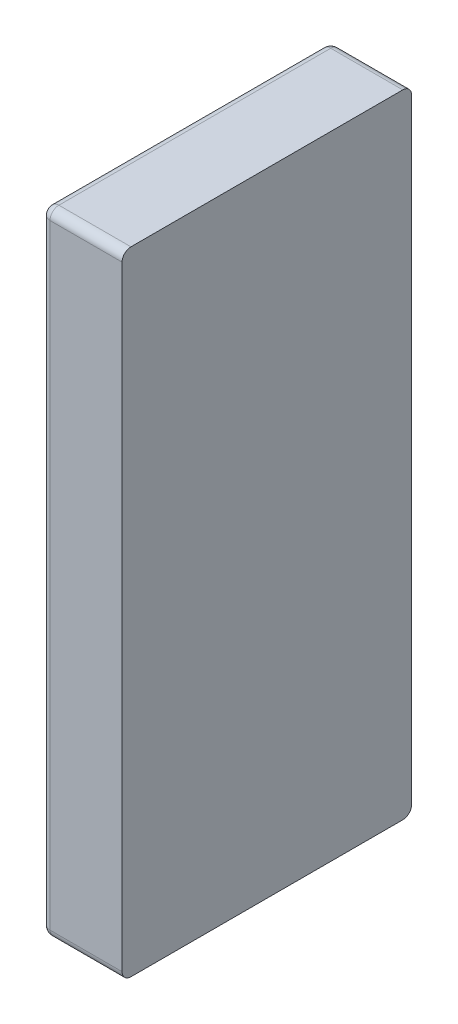
ISO-10303-21;
HEADER;
FILE_DESCRIPTION(('STEP AP214'),'2;1');
FILE_NAME('part.step','',(''),(''),'','','');
FILE_SCHEMA(('AUTOMOTIVE_DESIGN { 1 0 10303 214 1 1 1 1 }'));
ENDSEC;
DATA;
#1=APPLICATION_CONTEXT('core data for automotive mechanical design processes');
#2=APPLICATION_PROTOCOL_DEFINITION('international standard','automotive_design',2000,#1);
#3=PRODUCT_CONTEXT('',#1,'mechanical');
#4=PRODUCT('Part','Part','',(#3));
#5=PRODUCT_RELATED_PRODUCT_CATEGORY('part','',(#4));
#6=PRODUCT_DEFINITION_FORMATION('','',#4);
#7=PRODUCT_DEFINITION_CONTEXT('part definition',#1,'design');
#8=PRODUCT_DEFINITION('design','',#6,#7);
#9=PRODUCT_DEFINITION_SHAPE('','',#8);
#10=(LENGTH_UNIT() NAMED_UNIT(*) SI_UNIT(.MILLI.,.METRE.));
#11=(NAMED_UNIT(*) PLANE_ANGLE_UNIT() SI_UNIT($,.RADIAN.));
#12=(NAMED_UNIT(*) SI_UNIT($,.STERADIAN.) SOLID_ANGLE_UNIT());
#13=UNCERTAINTY_MEASURE_WITH_UNIT(LENGTH_MEASURE(1.E-05),#10,'distance_accuracy_value','');
#14=(GEOMETRIC_REPRESENTATION_CONTEXT(3) GLOBAL_UNCERTAINTY_ASSIGNED_CONTEXT((#13)) GLOBAL_UNIT_ASSIGNED_CONTEXT((#10,
#11,#12)) REPRESENTATION_CONTEXT('',''));
#15=CARTESIAN_POINT('',(0.,0.,0.));
#16=DIRECTION('',(0.,0.,1.));
#17=DIRECTION('',(1.,0.,0.));
#18=AXIS2_PLACEMENT_3D('',#15,#16,#17);
#19=CARTESIAN_POINT('',(-2.78,2.43,0.07));
#20=DIRECTION('',(-0.816496580927727,-0.408248290463861,0.408248290463863));
#21=DIRECTION('',(-0.577350269189624,0.577350269189627,-0.577350269189627));
#22=AXIS2_PLACEMENT_3D('',#19,#20,#21);
#23=SPHERICAL_SURFACE('',#22,0.0700000000000001);
#24=CARTESIAN_POINT('',(-2.78,2.43,0.07));
#25=DIRECTION('',(-1.,0.,0.));
#26=DIRECTION('',(0.,0.,-1.));
#27=AXIS2_PLACEMENT_3D('',#24,#25,#26);
#28=CIRCLE('',#27,0.07);
#29=CARTESIAN_POINT('',(-2.78,2.5,0.07));
#30=VERTEX_POINT('',#29);
#31=CARTESIAN_POINT('',(-2.78,2.43,0.));
#32=VERTEX_POINT('',#31);
#33=EDGE_CURVE('E11',#30,#32,#28,.T.);
#34=ORIENTED_EDGE('',*,*,#33,.T.);
#35=CARTESIAN_POINT('',(-2.78,2.43,0.07));
#36=DIRECTION('',(0.,1.,0.));
#37=DIRECTION('',(-1.,0.,0.));
#38=AXIS2_PLACEMENT_3D('',#35,#36,#37);
#39=CIRCLE('',#38,0.0700000000000001);
#40=CARTESIAN_POINT('',(-2.85,2.43,0.07));
#41=VERTEX_POINT('',#40);
#42=EDGE_CURVE('E25',#32,#41,#39,.T.);
#43=ORIENTED_EDGE('',*,*,#42,.T.);
#44=CARTESIAN_POINT('',(-2.85,2.43,0.0700000000000005));
#45=CARTESIAN_POINT('',(-2.85000000206626,2.4304874813201,0.0697767745761518));
#46=CARTESIAN_POINT('',(-2.84999384010573,2.43097733346503,0.0695587410365644));
#47=CARTESIAN_POINT('',(-2.8499691573104,2.43196304014063,0.06913222850245));
#48=CARTESIAN_POINT('',(-2.84995059052927,2.43245891023223,0.0689237881194444));
#49=CARTESIAN_POINT('',(-2.84990097464897,2.43345613611957,0.0685165345426472));
#50=CARTESIAN_POINT('',(-2.84986987909895,2.43395750549965,0.0683177602943073));
#51=CARTESIAN_POINT('',(-2.84979509510893,2.43496521106497,0.0679298920821065));
#52=CARTESIAN_POINT('',(-2.84975135985471,2.43547155882798,0.0677408372400339));
#53=CARTESIAN_POINT('',(-2.84965119491654,2.43648869779836,0.0673724472141637));
#54=CARTESIAN_POINT('',(-2.84959471818054,2.43699949855141,0.0671931511943856));
#55=CARTESIAN_POINT('',(-2.84946897965436,2.43802501479061,0.0668443034150112));
#56=CARTESIAN_POINT('',(-2.84939967070508,2.43853973777392,0.066674790726142));
#57=CARTESIAN_POINT('',(-2.84924818567489,2.43957257383873,0.0663455177824273));
#58=CARTESIAN_POINT('',(-2.84916596244726,2.44009069239971,0.0661857963666241));
#59=CARTESIAN_POINT('',(-2.84898858421692,2.44112976564605,0.0658761055655129));
#60=CARTESIAN_POINT('',(-2.84889338222952,2.4416507237105,0.0657261746825474));
#61=CARTESIAN_POINT('',(-2.8485877205279,2.44321993720918,0.0652901832361161));
#62=CARTESIAN_POINT('',(-2.84835803197204,2.44426888459853,0.0650197187830971));
#63=CARTESIAN_POINT('',(-2.84784652254829,2.44637168335242,0.0645172514527333));
#64=CARTESIAN_POINT('',(-2.84756433486845,2.44742551493961,0.0642855424422167));
#65=CARTESIAN_POINT('',(-2.84694764785681,2.44953389919347,0.0638599954732628));
#66=CARTESIAN_POINT('',(-2.84661279215772,2.45058840409773,0.0636664373808504));
#67=CARTESIAN_POINT('',(-2.84589079281523,2.45269385338061,0.0633164117496736));
#68=CARTESIAN_POINT('',(-2.8455033066169,2.45374472385384,0.0631602074423954));
#69=CARTESIAN_POINT('',(-2.84467625205081,2.45583869132302,0.0628838798409964));
#70=CARTESIAN_POINT('',(-2.84423635779512,2.45688169168713,0.0627640006938112));
#71=CARTESIAN_POINT('',(-2.84330488465907,2.45895575325333,0.0625591036258645));
#72=CARTESIAN_POINT('',(-2.84281299909642,2.45998669864054,0.0624743089294363));
#73=CARTESIAN_POINT('',(-2.84177813301801,2.46203256127936,0.0623381552763218));
#74=CARTESIAN_POINT('',(-2.84123486716985,2.46304734745794,0.0622869972987325));
#75=CARTESIAN_POINT('',(-2.84009802413897,2.46505689468467,0.0622164956852553));
#76=CARTESIAN_POINT('',(-2.83950418472667,2.46605151352216,0.062197330001435));
#77=CARTESIAN_POINT('',(-2.8382671724647,2.46801683962333,0.0621890053710471));
#78=CARTESIAN_POINT('',(-2.83762376183947,2.4689873977904,0.0622000010890885));
#79=CARTESIAN_POINT('',(-2.83628877895055,2.47090084368802,0.0622500164569502));
#80=CARTESIAN_POINT('',(-2.83559699431462,2.47184357973086,0.0622891677258503));
#81=CARTESIAN_POINT('',(-2.83416662779595,2.47369776678133,0.0623933480544385));
#82=CARTESIAN_POINT('',(-2.83342785949449,2.47460906777463,0.0624584864036654));
#83=CARTESIAN_POINT('',(-2.83190508044286,2.47639693029488,0.062612344187364));
#84=CARTESIAN_POINT('',(-2.83112090938521,2.47727334764635,0.0627011517384574));
#85=CARTESIAN_POINT('',(-2.82950906694762,2.47898816375513,0.0628999142390151));
#86=CARTESIAN_POINT('',(-2.82868126114628,2.47982642818087,0.063009937691301));
#87=CARTESIAN_POINT('',(-2.82698407471657,2.4814618488789,0.0632485756592094));
#88=CARTESIAN_POINT('',(-2.82611458495705,2.48225888445306,0.0633772409837291));
#89=CARTESIAN_POINT('',(-2.8243361346439,2.48380896078606,0.0636504987195311));
#90=CARTESIAN_POINT('',(-2.82342708929722,2.48456189800542,0.0637951264818358));
#91=CARTESIAN_POINT('',(-2.82157180469314,2.48602110618787,0.0640975530773523));
#92=CARTESIAN_POINT('',(-2.8206255036887,2.48672729398795,0.0642553743091527));
#93=CARTESIAN_POINT('',(-2.81869815097914,2.48809055836898,0.0645813559045133));
#94=CARTESIAN_POINT('',(-2.81771705895925,2.48874757503617,0.0647495284405914));
#95=CARTESIAN_POINT('',(-2.81572272641903,2.49001028880187,0.065093321327261));
#96=CARTESIAN_POINT('',(-2.81470946510086,2.4906159517311,0.0652689465218397));
#97=CARTESIAN_POINT('',(-2.81265354703255,2.49177399524783,0.065624710917588));
#98=CARTESIAN_POINT('',(-2.8116108868065,2.49232636950045,0.0658048506522411));
#99=CARTESIAN_POINT('',(-2.80949906598502,2.4933761262179,0.0661666849707887));
#100=CARTESIAN_POINT('',(-2.80842991678492,2.49387353184363,0.0663483788648056));
#101=CARTESIAN_POINT('',(-2.80626814547304,2.49481190168037,0.0667103542994619));
#102=CARTESIAN_POINT('',(-2.80517554694744,2.49525291976205,0.0668906370312958));
#103=CARTESIAN_POINT('',(-2.80297002658045,2.49607732993965,0.0672468322737049));
#104=CARTESIAN_POINT('',(-2.80185713763443,2.49646080736785,0.0674227509261944));
#105=CARTESIAN_POINT('',(-2.79961429717959,2.49716922055812,0.0677672868280055));
#106=CARTESIAN_POINT('',(-2.79848438482344,2.49749427339343,0.0679359181527239));
#107=CARTESIAN_POINT('',(-2.79621085819755,2.49808519348199,0.0682629921853479));
#108=CARTESIAN_POINT('',(-2.79506728614881,2.49835120934929,0.0684214597459934));
#109=CARTESIAN_POINT('',(-2.79276988770011,2.49882368354877,0.0687253799396497));
#110=CARTESIAN_POINT('',(-2.79161610330351,2.4990303213577,0.0688708708566112));
#111=CARTESIAN_POINT('',(-2.78930180551293,2.49938394330358,0.06914608955333));
#112=CARTESIAN_POINT('',(-2.78814133054851,2.49953113661097,0.0692758714596993));
#113=CARTESIAN_POINT('',(-2.78581722900015,2.49976603321528,0.0695170167979853));
#114=CARTESIAN_POINT('',(-2.78465363394825,2.49985397379105,0.069628452326128));
#115=CARTESIAN_POINT('',(-2.78232695557476,2.49997083984457,0.0698303643638208));
#116=CARTESIAN_POINT('',(-2.78116389339873,2.50000002843955,0.0699209327027657));
#117=CARTESIAN_POINT('',(-2.78,2.5,0.0700000000000001));
#118=B_SPLINE_CURVE_WITH_KNOTS('',3,(#44,#45,#46,#47,#48,#49,#50,#51,#52,#53,#54,#55,#56,#57,
#58,#59,#60,#61,#62,#63,#64,#65,#66,#67,#68,#69,#70,#71,#72,#73,#74,#75,#76,#77,#78,#79,#80,#81,
#82,#83,#84,#85,#86,#87,#88,#89,#90,#91,#92,#93,#94,#95,#96,#97,#98,#99,#100,#101,#102,#103,
#104,#105,#106,#107,#108,#109,#110,#111,#112,#113,#114,#115,#116,#117),.UNSPECIFIED.,.F.,.F.,(4,
2,2,2,2,2,2,2,2,2,2,2,2,2,2,2,2,2,2,2,2,2,2,2,2,2,2,2,2,2,2,2,2,2,2,2,4),(0.,
0.00160840578884747,0.00322280224025128,0.00484324002436266,0.00646975814296304,
0.0081023839867143,0.00974113341428196,0.0113860108521798,0.0130370094141908,0.0163569274323959,
0.0197009778357131,0.0230687142113657,0.0264595262724858,0.0298726472793758,0.0333071621394036,
0.0367620160856598,0.0402360238455766,0.0437278792213419,0.0472361650139629,0.0507593632320318,
0.0542958655345447,0.0578439838644811,0.0614019612362881,0.0649679826458845,0.0685401860764348,
0.0721166735769144,0.0756955223934612,0.0792747961357453,0.0828525559621087,0.0864268717680411,
0.0899958333627092,0.0935575616177358,0.0971102195712024,0.100652023467952,0.10418125371461,
0.107696265724312,0.111195500621916),.UNSPECIFIED.);
#119=EDGE_CURVE('E243',#41,#30,#118,.T.);
#120=ORIENTED_EDGE('',*,*,#119,.T.);
#121=EDGE_LOOP('',(#34,#43,#120));
#122=FACE_BOUND('',#121,.T.);
#123=ADVANCED_FACE('F17',(#122),#23,.T.);
#124=CARTESIAN_POINT('',(-2.78,-2.43,0.07));
#125=DIRECTION('',(-0.816496580927727,0.408248290463861,0.408248290463863));
#126=DIRECTION('',(-0.577350269189624,-0.577350269189627,-0.577350269189627));
#127=AXIS2_PLACEMENT_3D('',#124,#125,#126);
#128=SPHERICAL_SURFACE('',#127,0.0700000000000001);
#129=CARTESIAN_POINT('',(-2.78,-2.43,0.07));
#130=DIRECTION('',(0.,-1.,0.));
#131=DIRECTION('',(0.,0.,-1.));
#132=AXIS2_PLACEMENT_3D('',#129,#130,#131);
#133=CIRCLE('',#132,0.07);
#134=CARTESIAN_POINT('',(-2.85,-2.43,0.07));
#135=VERTEX_POINT('',#134);
#136=CARTESIAN_POINT('',(-2.78,-2.43,0.));
#137=VERTEX_POINT('',#136);
#138=EDGE_CURVE('E241',#135,#137,#133,.T.);
#139=ORIENTED_EDGE('',*,*,#138,.T.);
#140=CARTESIAN_POINT('',(-2.78,-2.43,0.07));
#141=DIRECTION('',(-1.,0.,0.));
#142=DIRECTION('',(0.,-1.,0.));
#143=AXIS2_PLACEMENT_3D('',#140,#141,#142);
#144=CIRCLE('',#143,0.0700000000000001);
#145=CARTESIAN_POINT('',(-2.78,-2.5,0.07));
#146=VERTEX_POINT('',#145);
#147=EDGE_CURVE('E239',#137,#146,#144,.T.);
#148=ORIENTED_EDGE('',*,*,#147,.T.);
#149=CARTESIAN_POINT('',(-2.78,-2.43,0.07));
#150=DIRECTION('',(0.,0.,-1.));
#151=DIRECTION('',(-1.,0.,0.));
#152=AXIS2_PLACEMENT_3D('',#149,#150,#151);
#153=CIRCLE('',#152,0.0700000000000001);
#154=EDGE_CURVE('E236',#146,#135,#153,.T.);
#155=ORIENTED_EDGE('',*,*,#154,.T.);
#156=EDGE_LOOP('',(#139,#148,#155));
#157=FACE_BOUND('',#156,.T.);
#158=ADVANCED_FACE('F282',(#157),#128,.T.);
#159=CARTESIAN_POINT('',(1.425,-2.43,0.07));
#160=DIRECTION('',(-1.,0.,0.));
#161=DIRECTION('',(0.,-0.707106781186548,-0.707106781186547));
#162=AXIS2_PLACEMENT_3D('',#159,#160,#161);
#163=CYLINDRICAL_SURFACE('',#162,0.07);
#164=CARTESIAN_POINT('',(-2.21,-2.43,0.07));
#165=DIRECTION('',(-1.,0.,0.));
#166=DIRECTION('',(0.,-0.707106781186548,-0.707106781186547));
#167=AXIS2_PLACEMENT_3D('',#164,#165,#166);
#168=CIRCLE('',#167,0.07);
#169=CARTESIAN_POINT('',(-2.21,-2.43,0.));
#170=VERTEX_POINT('',#169);
#171=CARTESIAN_POINT('',(-2.21,-2.5,0.07));
#172=VERTEX_POINT('',#171);
#173=EDGE_CURVE('E234',#170,#172,#168,.T.);
#174=ORIENTED_EDGE('',*,*,#173,.T.);
#175=DIRECTION('',(-1.,0.,0.));
#176=VECTOR('',#175,1.);
#177=CARTESIAN_POINT('',(1.425,-2.5,0.07));
#178=LINE('',#177,#176);
#179=EDGE_CURVE('E231',#172,#146,#178,.T.);
#180=ORIENTED_EDGE('',*,*,#179,.T.);
#181=ORIENTED_EDGE('',*,*,#147,.F.);
#182=DIRECTION('',(1.,0.,0.));
#183=VECTOR('',#182,1.);
#184=CARTESIAN_POINT('',(1.425,-2.43,0.));
#185=LINE('',#184,#183);
#186=EDGE_CURVE('E228',#137,#170,#185,.T.);
#187=ORIENTED_EDGE('',*,*,#186,.T.);
#188=EDGE_LOOP('',(#174,#180,#181,#187));
#189=FACE_BOUND('',#188,.T.);
#190=ADVANCED_FACE('F277',(#189),#163,.T.);
#191=CARTESIAN_POINT('',(-2.78,2.43,2.22));
#192=DIRECTION('',(-0.408248290463861,-0.816496580927728,0.408248290463861));
#193=DIRECTION('',(-0.577350269189627,0.577350269189623,0.577350269189627));
#194=AXIS2_PLACEMENT_3D('',#191,#192,#193);
#195=SPHERICAL_SURFACE('',#194,0.0700000000000001);
#196=CARTESIAN_POINT('',(-2.78,2.43,2.22));
#197=DIRECTION('',(-1.,0.,0.));
#198=DIRECTION('',(0.,1.,0.));
#199=AXIS2_PLACEMENT_3D('',#196,#197,#198);
#200=CIRCLE('',#199,0.0700000000000001);
#201=CARTESIAN_POINT('',(-2.78,2.43,2.29));
#202=VERTEX_POINT('',#201);
#203=CARTESIAN_POINT('',(-2.78,2.5,2.22));
#204=VERTEX_POINT('',#203);
#205=EDGE_CURVE('E226',#202,#204,#200,.T.);
#206=ORIENTED_EDGE('',*,*,#205,.T.);
#207=CARTESIAN_POINT('',(-2.78,2.43,2.22));
#208=DIRECTION('',(0.,0.,1.));
#209=DIRECTION('',(-1.,0.,0.));
#210=AXIS2_PLACEMENT_3D('',#207,#208,#209);
#211=CIRCLE('',#210,0.0700000000000001);
#212=CARTESIAN_POINT('',(-2.85,2.43,2.22));
#213=VERTEX_POINT('',#212);
#214=EDGE_CURVE('E224',#204,#213,#211,.T.);
#215=ORIENTED_EDGE('',*,*,#214,.T.);
#216=CARTESIAN_POINT('',(-2.78,2.43,2.22));
#217=DIRECTION('',(0.,1.,0.));
#218=DIRECTION('',(0.,0.,1.));
#219=AXIS2_PLACEMENT_3D('',#216,#217,#218);
#220=CIRCLE('',#219,0.0700000000000001);
#221=EDGE_CURVE('E221',#213,#202,#220,.T.);
#222=ORIENTED_EDGE('',*,*,#221,.T.);
#223=EDGE_LOOP('',(#206,#215,#222));
#224=FACE_BOUND('',#223,.T.);
#225=ADVANCED_FACE('F319',(#224),#195,.T.);
#226=CARTESIAN_POINT('',(-2.78,2.43,0.));
#227=DIRECTION('',(0.,0.,1.));
#228=DIRECTION('',(-0.707106781186548,0.707106781186548,0.));
#229=AXIS2_PLACEMENT_3D('',#226,#227,#228);
#230=CYLINDRICAL_SURFACE('',#229,0.07);
#231=ORIENTED_EDGE('',*,*,#214,.F.);
#232=DIRECTION('',(0.,0.,-1.));
#233=VECTOR('',#232,1.);
#234=CARTESIAN_POINT('',(-2.78,2.5,0.));
#235=LINE('',#234,#233);
#236=EDGE_CURVE('E216',#204,#30,#235,.T.);
#237=ORIENTED_EDGE('',*,*,#236,.T.);
#238=ORIENTED_EDGE('',*,*,#119,.F.);
#239=DIRECTION('',(0.,0.,1.));
#240=VECTOR('',#239,1.);
#241=CARTESIAN_POINT('',(-2.85,2.43,0.));
#242=LINE('',#241,#240);
#243=EDGE_CURVE('E211',#41,#213,#242,.T.);
#244=ORIENTED_EDGE('',*,*,#243,.T.);
#245=EDGE_LOOP('',(#231,#237,#238,#244));
#246=FACE_BOUND('',#245,.T.);
#247=ADVANCED_FACE('F193',(#246),#230,.T.);
#248=CARTESIAN_POINT('',(-2.78,-2.43,2.22));
#249=DIRECTION('',(0.408248290463861,-0.816496580927728,-0.408248290463861));
#250=DIRECTION('',(-0.577350269189627,-0.577350269189623,0.577350269189627));
#251=AXIS2_PLACEMENT_3D('',#248,#249,#250);
#252=SPHERICAL_SURFACE('',#251,0.0700000000000001);
#253=CARTESIAN_POINT('',(-2.78,-2.43,2.22));
#254=DIRECTION('',(0.,-1.,0.));
#255=DIRECTION('',(-1.,0.,0.));
#256=AXIS2_PLACEMENT_3D('',#253,#254,#255);
#257=CIRCLE('',#256,0.0700000000000001);
#258=CARTESIAN_POINT('',(-2.78,-2.43,2.29));
#259=VERTEX_POINT('',#258);
#260=CARTESIAN_POINT('',(-2.85,-2.43,2.22));
#261=VERTEX_POINT('',#260);
#262=EDGE_CURVE('E209',#259,#261,#257,.T.);
#263=ORIENTED_EDGE('',*,*,#262,.T.);
#264=CARTESIAN_POINT('',(-2.85,-2.43,2.22));
#265=CARTESIAN_POINT('',(-2.85000002843955,-2.43116389339873,2.22007906729723));
#266=CARTESIAN_POINT('',(-2.84997083984457,-2.43232695557476,2.22016963563618));
#267=CARTESIAN_POINT('',(-2.84985397379105,-2.43465363394825,2.22037154767387));
#268=CARTESIAN_POINT('',(-2.84976603321528,-2.43581722900015,2.22048298320201));
#269=CARTESIAN_POINT('',(-2.84953113661097,-2.43814133054851,2.2207241285403));
#270=CARTESIAN_POINT('',(-2.84938394330358,-2.43930180551293,2.22085391044667));
#271=CARTESIAN_POINT('',(-2.8490303213577,-2.44161610330351,2.22112912914339));
#272=CARTESIAN_POINT('',(-2.84882368354877,-2.44276988770011,2.22127462006035));
#273=CARTESIAN_POINT('',(-2.84835120934929,-2.44506728614881,2.22157854025401));
#274=CARTESIAN_POINT('',(-2.84808519348199,-2.44621085819755,2.22173700781465));
#275=CARTESIAN_POINT('',(-2.84749427339343,-2.44848438482344,2.22206408184728));
#276=CARTESIAN_POINT('',(-2.84716922055812,-2.44961429717959,2.22223271317199));
#277=CARTESIAN_POINT('',(-2.84646080736785,-2.45185713763443,2.22257724907381));
#278=CARTESIAN_POINT('',(-2.84607732993965,-2.45297002658045,2.2227531677263));
#279=CARTESIAN_POINT('',(-2.84525291976205,-2.45517554694744,2.2231093629687));
#280=CARTESIAN_POINT('',(-2.84481190168037,-2.45626814547304,2.22328964570054));
#281=CARTESIAN_POINT('',(-2.84387353184363,-2.45842991678492,2.22365162113519));
#282=CARTESIAN_POINT('',(-2.8433761262179,-2.45949906598502,2.22383331502921));
#283=CARTESIAN_POINT('',(-2.84232636950045,-2.4616108868065,2.22419514934776));
#284=CARTESIAN_POINT('',(-2.84177399524783,-2.46265354703255,2.22437528908241));
#285=CARTESIAN_POINT('',(-2.8406159517311,-2.46470946510086,2.22473105347816));
#286=CARTESIAN_POINT('',(-2.84001028880187,-2.46572272641903,2.22490667867274));
#287=CARTESIAN_POINT('',(-2.83874757503617,-2.46771705895925,2.22525047155941));
#288=CARTESIAN_POINT('',(-2.83809055836898,-2.46869815097914,2.22541864409549));
#289=CARTESIAN_POINT('',(-2.83672729398795,-2.4706255036887,2.22574462569085));
#290=CARTESIAN_POINT('',(-2.83602110618787,-2.47157180469314,2.22590244692265));
#291=CARTESIAN_POINT('',(-2.83456189800542,-2.47342708929722,2.22620487351816));
#292=CARTESIAN_POINT('',(-2.83380896078606,-2.4743361346439,2.22634950128047));
#293=CARTESIAN_POINT('',(-2.83225888445306,-2.47611458495705,2.22662275901627));
#294=CARTESIAN_POINT('',(-2.8314618488789,-2.47698407471657,2.22675142434079));
#295=CARTESIAN_POINT('',(-2.82982642818087,-2.47868126114628,2.2269900623087));
#296=CARTESIAN_POINT('',(-2.82898816375513,-2.47950906694762,2.22710008576098));
#297=CARTESIAN_POINT('',(-2.82727334764635,-2.48112090938521,2.22729884826154));
#298=CARTESIAN_POINT('',(-2.82639693029488,-2.48190508044286,2.22738765581264));
#299=CARTESIAN_POINT('',(-2.82460906777463,-2.48342785949449,2.22754151359633));
#300=CARTESIAN_POINT('',(-2.82369776678133,-2.48416662779595,2.22760665194556));
#301=CARTESIAN_POINT('',(-2.82184357973086,-2.48559699431462,2.22771083227415));
#302=CARTESIAN_POINT('',(-2.82090084368802,-2.48628877895055,2.22774998354305));
#303=CARTESIAN_POINT('',(-2.8189873977904,-2.48762376183947,2.22779999891091));
#304=CARTESIAN_POINT('',(-2.81801683962333,-2.4882671724647,2.22781099462895));
#305=CARTESIAN_POINT('',(-2.81605151352216,-2.48950418472667,2.22780266999857));
#306=CARTESIAN_POINT('',(-2.81505689468467,-2.49009802413897,2.22778350431475));
#307=CARTESIAN_POINT('',(-2.81304734745794,-2.49123486716985,2.22771300270127));
#308=CARTESIAN_POINT('',(-2.81203256127937,-2.49177813301801,2.22766184472368));
#309=CARTESIAN_POINT('',(-2.80998669864054,-2.49281299909642,2.22752569107056));
#310=CARTESIAN_POINT('',(-2.80895575325333,-2.49330488465907,2.22744089637414));
#311=CARTESIAN_POINT('',(-2.80688169168713,-2.49423635779512,2.22723599930619));
#312=CARTESIAN_POINT('',(-2.80583869132302,-2.49467625205081,2.227116120159));
#313=CARTESIAN_POINT('',(-2.80374472385384,-2.4955033066169,2.2268397925576));
#314=CARTESIAN_POINT('',(-2.80269385338061,-2.49589079281523,2.22668358825033));
#315=CARTESIAN_POINT('',(-2.80058840409773,-2.49661279215772,2.22633356261915));
#316=CARTESIAN_POINT('',(-2.79953389919347,-2.49694764785681,2.22614000452674));
#317=CARTESIAN_POINT('',(-2.79742551493961,-2.49756433486845,2.22571445755778));
#318=CARTESIAN_POINT('',(-2.79637168335242,-2.49784652254829,2.22548274854727));
#319=CARTESIAN_POINT('',(-2.79426888459853,-2.49835803197204,2.2249802812169));
#320=CARTESIAN_POINT('',(-2.79321993720918,-2.4985877205279,2.22470981676388));
#321=CARTESIAN_POINT('',(-2.7916507237105,-2.49889338222952,2.22427382531745));
#322=CARTESIAN_POINT('',(-2.79112976564605,-2.49898858421692,2.22412389443449));
#323=CARTESIAN_POINT('',(-2.79009069239971,-2.49916596244726,2.22381420363338));
#324=CARTESIAN_POINT('',(-2.78957257383873,-2.49924818567489,2.22365448221757));
#325=CARTESIAN_POINT('',(-2.78853973777392,-2.49939967070507,2.22332520927386));
#326=CARTESIAN_POINT('',(-2.78802501479061,-2.49946897965436,2.22315569658499));
#327=CARTESIAN_POINT('',(-2.78699949855141,-2.49959471818054,2.22280684880561));
#328=CARTESIAN_POINT('',(-2.78648869779836,-2.49965119491654,2.22262755278584));
#329=CARTESIAN_POINT('',(-2.78547155882798,-2.49975135985471,2.22225916275997));
#330=CARTESIAN_POINT('',(-2.78496521106497,-2.49979509510893,2.22207010791789));
#331=CARTESIAN_POINT('',(-2.78395750549965,-2.49986987909895,2.22168223970569));
#332=CARTESIAN_POINT('',(-2.78345613611957,-2.49990097464897,2.22148346545735));
#333=CARTESIAN_POINT('',(-2.78245891023223,-2.49995059052927,2.22107621188056));
#334=CARTESIAN_POINT('',(-2.78196304014063,-2.4999691573104,2.22086777149755));
#335=CARTESIAN_POINT('',(-2.78097733346503,-2.49999384010573,2.22044125896344));
#336=CARTESIAN_POINT('',(-2.7804874813201,-2.50000000206626,2.22022322542385));
#337=CARTESIAN_POINT('',(-2.78,-2.5,2.22));
#338=B_SPLINE_CURVE_WITH_KNOTS('',3,(#264,#265,#266,#267,#268,#269,#270,#271,#272,#273,#274,
#275,#276,#277,#278,#279,#280,#281,#282,#283,#284,#285,#286,#287,#288,#289,#290,#291,#292,#293,
#294,#295,#296,#297,#298,#299,#300,#301,#302,#303,#304,#305,#306,#307,#308,#309,#310,#311,#312,
#313,#314,#315,#316,#317,#318,#319,#320,#321,#322,#323,#324,#325,#326,#327,#328,#329,#330,#331,
#332,#333,#334,#335,#336,#337),.UNSPECIFIED.,.F.,.F.,(4,2,2,2,2,2,2,2,2,2,2,2,2,2,2,2,2,2,2,2,2,
2,2,2,2,2,2,2,2,2,2,2,2,2,2,2,4),(0.,0.00349923489760395,0.00701424690730654,0.010543477153964,
0.0140852810507141,0.0176379390041803,0.0211996672592068,0.0247686288538753,0.0283429446598074,
0.0319207044861711,0.0354999782284548,0.0390788270450017,0.0426553145454816,0.0462275179760319,
0.0497935393856277,0.053351516757435,0.0568996350873717,0.060436137389884,0.0639593356079535,
0.0674676214005741,0.0709594767763396,0.0744334845362564,0.0778883384825126,0.0813228533425399,
0.0847359743494304,0.0881267864105507,0.0914945227862032,0.0948385731895204,0.0981584912077255,
0.0998094897697365,0.101454367207634,0.103093116635202,0.104725742478953,0.106352260597554,
0.107972698381665,0.109587094833068,0.111195500621916),.UNSPECIFIED.);
#339=CARTESIAN_POINT('',(-2.78,-2.5,2.22));
#340=VERTEX_POINT('',#339);
#341=EDGE_CURVE('E169',#261,#340,#338,.T.);
#342=ORIENTED_EDGE('',*,*,#341,.T.);
#343=CARTESIAN_POINT('',(-2.78,-2.43,2.22));
#344=DIRECTION('',(-1.,0.,0.));
#345=DIRECTION('',(0.,0.,1.));
#346=AXIS2_PLACEMENT_3D('',#343,#344,#345);
#347=CIRCLE('',#346,0.0700000000000001);
#348=EDGE_CURVE('E164',#340,#259,#347,.T.);
#349=ORIENTED_EDGE('',*,*,#348,.T.);
#350=EDGE_LOOP('',(#263,#342,#349));
#351=FACE_BOUND('',#350,.T.);
#352=ADVANCED_FACE('F187',(#351),#252,.T.);
#353=CARTESIAN_POINT('',(-2.78,-2.43,0.));
#354=DIRECTION('',(0.,0.,1.));
#355=DIRECTION('',(-0.707106781186548,-0.707106781186548,0.));
#356=AXIS2_PLACEMENT_3D('',#353,#354,#355);
#357=CYLINDRICAL_SURFACE('',#356,0.07);
#358=ORIENTED_EDGE('',*,*,#341,.F.);
#359=DIRECTION('',(0.,0.,-1.));
#360=VECTOR('',#359,1.);
#361=CARTESIAN_POINT('',(-2.85,-2.43,0.));
#362=LINE('',#361,#360);
#363=EDGE_CURVE('E159',#261,#135,#362,.T.);
#364=ORIENTED_EDGE('',*,*,#363,.T.);
#365=ORIENTED_EDGE('',*,*,#154,.F.);
#366=DIRECTION('',(0.,0.,1.));
#367=VECTOR('',#366,1.);
#368=CARTESIAN_POINT('',(-2.78,-2.5,0.));
#369=LINE('',#368,#367);
#370=EDGE_CURVE('E154',#146,#340,#369,.T.);
#371=ORIENTED_EDGE('',*,*,#370,.T.);
#372=EDGE_LOOP('',(#358,#364,#365,#371));
#373=FACE_BOUND('',#372,.T.);
#374=ADVANCED_FACE('F176',(#373),#357,.T.);
#375=CARTESIAN_POINT('',(1.425,-2.43,2.22));
#376=DIRECTION('',(-1.,0.,0.));
#377=DIRECTION('',(0.,-0.707106781186548,0.707106781186548));
#378=AXIS2_PLACEMENT_3D('',#375,#376,#377);
#379=CYLINDRICAL_SURFACE('',#378,0.07);
#380=CARTESIAN_POINT('',(-2.21,-2.43,2.22));
#381=DIRECTION('',(-1.,0.,0.));
#382=DIRECTION('',(0.,-0.707106781186548,0.707106781186548));
#383=AXIS2_PLACEMENT_3D('',#380,#381,#382);
#384=CIRCLE('',#383,0.07);
#385=CARTESIAN_POINT('',(-2.21,-2.5,2.22));
#386=VERTEX_POINT('',#385);
#387=CARTESIAN_POINT('',(-2.21,-2.43,2.29));
#388=VERTEX_POINT('',#387);
#389=EDGE_CURVE('E152',#386,#388,#384,.T.);
#390=ORIENTED_EDGE('',*,*,#389,.T.);
#391=DIRECTION('',(-1.,0.,0.));
#392=VECTOR('',#391,1.);
#393=CARTESIAN_POINT('',(1.425,-2.43,2.29));
#394=LINE('',#393,#392);
#395=EDGE_CURVE('E149',#388,#259,#394,.T.);
#396=ORIENTED_EDGE('',*,*,#395,.T.);
#397=ORIENTED_EDGE('',*,*,#348,.F.);
#398=DIRECTION('',(1.,0.,0.));
#399=VECTOR('',#398,1.);
#400=CARTESIAN_POINT('',(1.425,-2.5,2.22));
#401=LINE('',#400,#399);
#402=EDGE_CURVE('E144',#340,#386,#401,.T.);
#403=ORIENTED_EDGE('',*,*,#402,.T.);
#404=EDGE_LOOP('',(#390,#396,#397,#403));
#405=FACE_BOUND('',#404,.T.);
#406=ADVANCED_FACE('F186',(#405),#379,.T.);
#407=CARTESIAN_POINT('',(-2.78,-1.25,2.22));
#408=DIRECTION('',(0.,1.,0.));
#409=DIRECTION('',(-0.707106781186548,0.,0.707106781186548));
#410=AXIS2_PLACEMENT_3D('',#407,#408,#409);
#411=CYLINDRICAL_SURFACE('',#410,0.07);
#412=ORIENTED_EDGE('',*,*,#221,.F.);
#413=DIRECTION('',(0.,-1.,0.));
#414=VECTOR('',#413,1.);
#415=CARTESIAN_POINT('',(-2.85,-1.25,2.22));
#416=LINE('',#415,#414);
#417=EDGE_CURVE('E139',#213,#261,#416,.T.);
#418=ORIENTED_EDGE('',*,*,#417,.T.);
#419=ORIENTED_EDGE('',*,*,#262,.F.);
#420=DIRECTION('',(0.,1.,0.));
#421=VECTOR('',#420,1.);
#422=CARTESIAN_POINT('',(-2.78,-1.25,2.29));
#423=LINE('',#422,#421);
#424=EDGE_CURVE('E136',#259,#202,#423,.T.);
#425=ORIENTED_EDGE('',*,*,#424,.T.);
#426=EDGE_LOOP('',(#412,#418,#419,#425));
#427=FACE_BOUND('',#426,.T.);
#428=ADVANCED_FACE('F326',(#427),#411,.T.);
#429=CARTESIAN_POINT('',(-1.425,2.43,2.22));
#430=DIRECTION('',(1.,0.,0.));
#431=DIRECTION('',(0.,0.707106781186548,0.707106781186548));
#432=AXIS2_PLACEMENT_3D('',#429,#430,#431);
#433=CYLINDRICAL_SURFACE('',#432,0.07);
#434=CARTESIAN_POINT('',(-2.21,2.43,2.22));
#435=DIRECTION('',(-1.,0.,0.));
#436=DIRECTION('',(0.,0.707106781186548,0.707106781186548));
#437=AXIS2_PLACEMENT_3D('',#434,#435,#436);
#438=CIRCLE('',#437,0.07);
#439=CARTESIAN_POINT('',(-2.21,2.43,2.29));
#440=VERTEX_POINT('',#439);
#441=CARTESIAN_POINT('',(-2.21,2.5,2.22));
#442=VERTEX_POINT('',#441);
#443=EDGE_CURVE('E134',#440,#442,#438,.T.);
#444=ORIENTED_EDGE('',*,*,#443,.T.);
#445=DIRECTION('',(-1.,0.,0.));
#446=VECTOR('',#445,1.);
#447=CARTESIAN_POINT('',(-1.425,2.5,2.22));
#448=LINE('',#447,#446);
#449=EDGE_CURVE('E111',#442,#204,#448,.T.);
#450=ORIENTED_EDGE('',*,*,#449,.T.);
#451=ORIENTED_EDGE('',*,*,#205,.F.);
#452=DIRECTION('',(1.,0.,0.));
#453=VECTOR('',#452,1.);
#454=CARTESIAN_POINT('',(-1.425,2.43,2.29));
#455=LINE('',#454,#453);
#456=EDGE_CURVE('E130',#202,#440,#455,.T.);
#457=ORIENTED_EDGE('',*,*,#456,.T.);
#458=EDGE_LOOP('',(#444,#450,#451,#457));
#459=FACE_BOUND('',#458,.T.);
#460=ADVANCED_FACE('F292',(#459),#433,.T.);
#461=CARTESIAN_POINT('',(-2.78,-1.25,0.07));
#462=DIRECTION('',(0.,1.,0.));
#463=DIRECTION('',(-0.707106781186548,0.,-0.707106781186547));
#464=AXIS2_PLACEMENT_3D('',#461,#462,#463);
#465=CYLINDRICAL_SURFACE('',#464,0.07);
#466=ORIENTED_EDGE('',*,*,#42,.F.);
#467=DIRECTION('',(0.,-1.,0.));
#468=VECTOR('',#467,1.);
#469=CARTESIAN_POINT('',(-2.78,-1.25,0.));
#470=LINE('',#469,#468);
#471=EDGE_CURVE('E127',#32,#137,#470,.T.);
#472=ORIENTED_EDGE('',*,*,#471,.T.);
#473=ORIENTED_EDGE('',*,*,#138,.F.);
#474=DIRECTION('',(0.,1.,0.));
#475=VECTOR('',#474,1.);
#476=CARTESIAN_POINT('',(-2.85,-1.25,0.07));
#477=LINE('',#476,#475);
#478=EDGE_CURVE('E98',#135,#41,#477,.T.);
#479=ORIENTED_EDGE('',*,*,#478,.T.);
#480=EDGE_LOOP('',(#466,#472,#473,#479));
#481=FACE_BOUND('',#480,.T.);
#482=ADVANCED_FACE('F270',(#481),#465,.T.);
#483=CARTESIAN_POINT('',(-1.425,2.43,0.07));
#484=DIRECTION('',(1.,0.,0.));
#485=DIRECTION('',(0.,0.707106781186548,-0.707106781186547));
#486=AXIS2_PLACEMENT_3D('',#483,#484,#485);
#487=CYLINDRICAL_SURFACE('',#486,0.07);
#488=CARTESIAN_POINT('',(-2.21,2.43,0.07));
#489=DIRECTION('',(-1.,0.,0.));
#490=DIRECTION('',(0.,0.707106781186548,-0.707106781186547));
#491=AXIS2_PLACEMENT_3D('',#488,#489,#490);
#492=CIRCLE('',#491,0.07);
#493=CARTESIAN_POINT('',(-2.21,2.5,0.07));
#494=VERTEX_POINT('',#493);
#495=CARTESIAN_POINT('',(-2.21,2.43,0.));
#496=VERTEX_POINT('',#495);
#497=EDGE_CURVE('E91',#494,#496,#492,.T.);
#498=ORIENTED_EDGE('',*,*,#497,.T.);
#499=DIRECTION('',(-1.,0.,0.));
#500=VECTOR('',#499,1.);
#501=CARTESIAN_POINT('',(-1.425,2.43,0.));
#502=LINE('',#501,#500);
#503=EDGE_CURVE('E99',#496,#32,#502,.T.);
#504=ORIENTED_EDGE('',*,*,#503,.T.);
#505=ORIENTED_EDGE('',*,*,#33,.F.);
#506=DIRECTION('',(1.,0.,0.));
#507=VECTOR('',#506,1.);
#508=CARTESIAN_POINT('',(-1.425,2.5,0.07));
#509=LINE('',#508,#507);
#510=EDGE_CURVE('E102',#30,#494,#509,.T.);
#511=ORIENTED_EDGE('',*,*,#510,.T.);
#512=EDGE_LOOP('',(#498,#504,#505,#511));
#513=FACE_BOUND('',#512,.T.);
#514=ADVANCED_FACE('F103',(#513),#487,.T.);
#515=CARTESIAN_POINT('',(2.85,-2.5,0.));
#516=DIRECTION('',(0.,1.,0.));
#517=DIRECTION('',(-1.,0.,0.));
#518=AXIS2_PLACEMENT_3D('',#515,#516,#517);
#519=PLANE('',#518);
#520=ORIENTED_EDGE('',*,*,#402,.F.);
#521=ORIENTED_EDGE('',*,*,#370,.F.);
#522=ORIENTED_EDGE('',*,*,#179,.F.);
#523=DIRECTION('',(0.,0.,1.));
#524=VECTOR('',#523,1.);
#525=CARTESIAN_POINT('',(-2.21,-2.5,0.5725));
#526=LINE('',#525,#524);
#527=EDGE_CURVE('E106',#172,#386,#526,.T.);
#528=ORIENTED_EDGE('',*,*,#527,.T.);
#529=EDGE_LOOP('',(#520,#521,#522,#528));
#530=FACE_BOUND('',#529,.T.);
#531=ADVANCED_FACE('F302',(#530),#519,.F.);
#532=CARTESIAN_POINT('',(0.,0.,0.));
#533=DIRECTION('',(0.,0.,-1.));
#534=DIRECTION('',(-1.,0.,0.));
#535=AXIS2_PLACEMENT_3D('',#532,#533,#534);
#536=PLANE('',#535);
#537=ORIENTED_EDGE('',*,*,#186,.F.);
#538=ORIENTED_EDGE('',*,*,#471,.F.);
#539=ORIENTED_EDGE('',*,*,#503,.F.);
#540=DIRECTION('',(0.,-1.,0.));
#541=VECTOR('',#540,1.);
#542=CARTESIAN_POINT('',(-2.21,0.,0.));
#543=LINE('',#542,#541);
#544=EDGE_CURVE('E96',#496,#170,#543,.T.);
#545=ORIENTED_EDGE('',*,*,#544,.T.);
#546=EDGE_LOOP('',(#537,#538,#539,#545));
#547=FACE_BOUND('',#546,.T.);
#548=ADVANCED_FACE('F274',(#547),#536,.T.);
#549=CARTESIAN_POINT('',(-2.85,-2.5,0.));
#550=DIRECTION('',(1.,0.,0.));
#551=DIRECTION('',(0.,1.,0.));
#552=AXIS2_PLACEMENT_3D('',#549,#550,#551);
#553=PLANE('',#552);
#554=ORIENTED_EDGE('',*,*,#363,.F.);
#555=ORIENTED_EDGE('',*,*,#417,.F.);
#556=ORIENTED_EDGE('',*,*,#243,.F.);
#557=ORIENTED_EDGE('',*,*,#478,.F.);
#558=EDGE_LOOP('',(#554,#555,#556,#557));
#559=FACE_BOUND('',#558,.T.);
#560=ADVANCED_FACE('F287',(#559),#553,.F.);
#561=CARTESIAN_POINT('',(-2.21,0.,1.145));
#562=DIRECTION('',(-1.,0.,0.));
#563=DIRECTION('',(0.,0.,1.));
#564=AXIS2_PLACEMENT_3D('',#561,#562,#563);
#565=PLANE('',#564);
#566=ORIENTED_EDGE('',*,*,#389,.F.);
#567=ORIENTED_EDGE('',*,*,#527,.F.);
#568=ORIENTED_EDGE('',*,*,#173,.F.);
#569=ORIENTED_EDGE('',*,*,#544,.F.);
#570=ORIENTED_EDGE('',*,*,#497,.F.);
#571=DIRECTION('',(0.,0.,-1.));
#572=VECTOR('',#571,1.);
#573=CARTESIAN_POINT('',(-2.21,2.5,0.5725));
#574=LINE('',#573,#572);
#575=EDGE_CURVE('E94',#442,#494,#574,.T.);
#576=ORIENTED_EDGE('',*,*,#575,.F.);
#577=ORIENTED_EDGE('',*,*,#443,.F.);
#578=DIRECTION('',(0.,1.,0.));
#579=VECTOR('',#578,1.);
#580=CARTESIAN_POINT('',(-2.21,0.,2.29));
#581=LINE('',#580,#579);
#582=EDGE_CURVE('E112',#388,#440,#581,.T.);
#583=ORIENTED_EDGE('',*,*,#582,.F.);
#584=EDGE_LOOP('',(#566,#567,#568,#569,#570,#576,#577,#583));
#585=FACE_BOUND('',#584,.T.);
#586=ADVANCED_FACE('F92',(#585),#565,.F.);
#587=CARTESIAN_POINT('',(-2.85,2.5,0.));
#588=DIRECTION('',(0.,-1.,0.));
#589=DIRECTION('',(1.,0.,0.));
#590=AXIS2_PLACEMENT_3D('',#587,#588,#589);
#591=PLANE('',#590);
#592=ORIENTED_EDGE('',*,*,#449,.F.);
#593=ORIENTED_EDGE('',*,*,#575,.T.);
#594=ORIENTED_EDGE('',*,*,#510,.F.);
#595=ORIENTED_EDGE('',*,*,#236,.F.);
#596=EDGE_LOOP('',(#592,#593,#594,#595));
#597=FACE_BOUND('',#596,.T.);
#598=ADVANCED_FACE('F109',(#597),#591,.F.);
#599=CARTESIAN_POINT('',(0.,0.,2.29));
#600=DIRECTION('',(0.,0.,-1.));
#601=DIRECTION('',(-1.,0.,0.));
#602=AXIS2_PLACEMENT_3D('',#599,#600,#601);
#603=PLANE('',#602);
#604=ORIENTED_EDGE('',*,*,#395,.F.);
#605=ORIENTED_EDGE('',*,*,#582,.T.);
#606=ORIENTED_EDGE('',*,*,#456,.F.);
#607=ORIENTED_EDGE('',*,*,#424,.F.);
#608=EDGE_LOOP('',(#604,#605,#606,#607));
#609=FACE_BOUND('',#608,.T.);
#610=ADVANCED_FACE('F298',(#609),#603,.F.);
#611=CLOSED_SHELL('',(#123,#158,#190,#225,#247,#352,#374,#406,#428,#460,#482,#514,#531,#548,
#560,#586,#598,#610));
#612=MANIFOLD_SOLID_BREP('B1',#611);
#613=ADVANCED_BREP_SHAPE_REPRESENTATION('',(#18,#612),#14);
#614=SHAPE_DEFINITION_REPRESENTATION(#9,#613);
ENDSEC;
END-ISO-10303-21;
